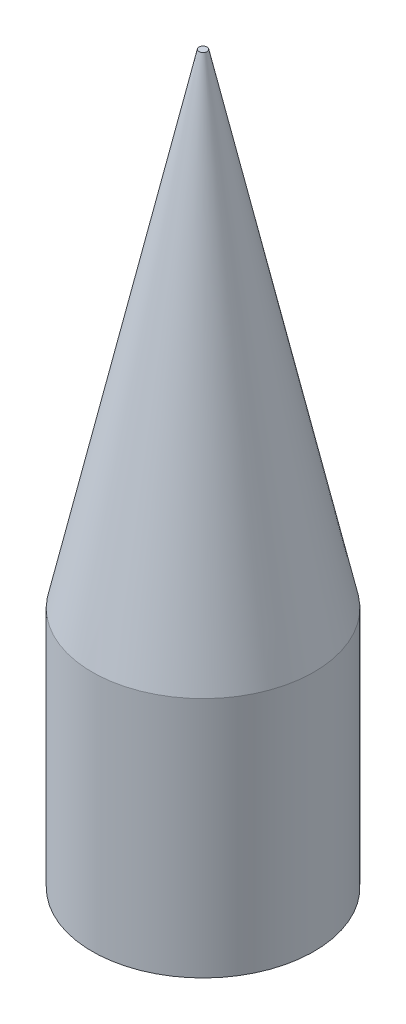
ISO-10303-21;
HEADER;
FILE_DESCRIPTION(('STEP AP214'),'2;1');
FILE_NAME('part.step','',(''),(''),'','','');
FILE_SCHEMA(('AUTOMOTIVE_DESIGN { 1 0 10303 214 1 1 1 1 }'));
ENDSEC;
DATA;
#1=APPLICATION_CONTEXT('core data for automotive mechanical design processes');
#2=APPLICATION_PROTOCOL_DEFINITION('international standard','automotive_design',2000,#1);
#3=PRODUCT_CONTEXT('',#1,'mechanical');
#4=PRODUCT('Part','Part','',(#3));
#5=PRODUCT_RELATED_PRODUCT_CATEGORY('part','',(#4));
#6=PRODUCT_DEFINITION_FORMATION('','',#4);
#7=PRODUCT_DEFINITION_CONTEXT('part definition',#1,'design');
#8=PRODUCT_DEFINITION('design','',#6,#7);
#9=PRODUCT_DEFINITION_SHAPE('','',#8);
#10=(LENGTH_UNIT() NAMED_UNIT(*) SI_UNIT(.MILLI.,.METRE.));
#11=(NAMED_UNIT(*) PLANE_ANGLE_UNIT() SI_UNIT($,.RADIAN.));
#12=(NAMED_UNIT(*) SI_UNIT($,.STERADIAN.) SOLID_ANGLE_UNIT());
#13=UNCERTAINTY_MEASURE_WITH_UNIT(LENGTH_MEASURE(1.E-05),#10,'distance_accuracy_value','');
#14=(GEOMETRIC_REPRESENTATION_CONTEXT(3) GLOBAL_UNCERTAINTY_ASSIGNED_CONTEXT((#13)) GLOBAL_UNIT_ASSIGNED_CONTEXT((#10,
#11,#12)) REPRESENTATION_CONTEXT('',''));
#15=CARTESIAN_POINT('',(0.,0.,0.));
#16=DIRECTION('',(0.,0.,1.));
#17=DIRECTION('',(1.,0.,0.));
#18=AXIS2_PLACEMENT_3D('',#15,#16,#17);
#19=CARTESIAN_POINT('',(0.,120.,0.));
#20=DIRECTION('',(0.,1.,0.));
#21=DIRECTION('',(0.,0.,1.));
#22=AXIS2_PLACEMENT_3D('',#19,#20,#21);
#23=PLANE('',#22);
#24=CARTESIAN_POINT('',(0.,120.,0.));
#25=DIRECTION('',(0.,-1.,0.));
#26=DIRECTION('',(0.,0.,-1.));
#27=AXIS2_PLACEMENT_3D('',#24,#25,#26);
#28=CIRCLE('',#27,1.);
#29=CARTESIAN_POINT('',(0.,120.,-0.999999999999997));
#30=VERTEX_POINT('',#29);
#31=EDGE_CURVE('E10',#30,#30,#28,.T.);
#32=ORIENTED_EDGE('',*,*,#31,.F.);
#33=EDGE_LOOP('',(#32));
#34=FACE_BOUND('',#33,.T.);
#35=ADVANCED_FACE('F31',(#34),#23,.T.);
#36=CARTESIAN_POINT('',(0.,0.,0.));
#37=DIRECTION('',(0.,-1.,0.));
#38=DIRECTION('',(0.,0.,-1.));
#39=AXIS2_PLACEMENT_3D('',#36,#37,#38);
#40=CONICAL_SURFACE('',#39,27.5,0.217345027847799);
#41=CARTESIAN_POINT('',(0.,0.,0.));
#42=DIRECTION('',(0.,-1.,0.));
#43=DIRECTION('',(0.,0.,-1.));
#44=AXIS2_PLACEMENT_3D('',#41,#42,#43);
#45=CIRCLE('',#44,27.5);
#46=CARTESIAN_POINT('',(0.,0.,-27.5));
#47=VERTEX_POINT('',#46);
#48=EDGE_CURVE('E37',#47,#47,#45,.T.);
#49=CARTESIAN_POINT('',(0.,120.,-0.999999999999997));
#50=CARTESIAN_POINT('',(0.,118.75,-1.27604166666667));
#51=CARTESIAN_POINT('',(0.,117.5,-1.55208333333333));
#52=CARTESIAN_POINT('',(0.,115.,-2.10416666666667));
#53=CARTESIAN_POINT('',(0.,113.75,-2.38020833333333));
#54=CARTESIAN_POINT('',(0.,111.25,-2.93229166666666));
#55=CARTESIAN_POINT('',(0.,110.,-3.20833333333333));
#56=CARTESIAN_POINT('',(0.,107.5,-3.76041666666667));
#57=CARTESIAN_POINT('',(0.,106.25,-4.03645833333333));
#58=CARTESIAN_POINT('',(0.,103.75,-4.58854166666667));
#59=CARTESIAN_POINT('',(0.,102.5,-4.86458333333333));
#60=CARTESIAN_POINT('',(0.,100.,-5.41666666666667));
#61=CARTESIAN_POINT('',(0.,98.75,-5.69270833333333));
#62=CARTESIAN_POINT('',(0.,96.25,-6.24479166666667));
#63=CARTESIAN_POINT('',(0.,95.,-6.52083333333333));
#64=CARTESIAN_POINT('',(0.,92.5,-7.07291666666666));
#65=CARTESIAN_POINT('',(0.,91.25,-7.34895833333333));
#66=CARTESIAN_POINT('',(0.,88.75,-7.90104166666667));
#67=CARTESIAN_POINT('',(0.,87.5,-8.17708333333333));
#68=CARTESIAN_POINT('',(0.,85.,-8.72916666666667));
#69=CARTESIAN_POINT('',(0.,83.75,-9.00520833333333));
#70=CARTESIAN_POINT('',(0.,81.25,-9.55729166666667));
#71=CARTESIAN_POINT('',(0.,80.,-9.83333333333333));
#72=CARTESIAN_POINT('',(0.,77.5,-10.3854166666667));
#73=CARTESIAN_POINT('',(0.,76.25,-10.6614583333333));
#74=CARTESIAN_POINT('',(0.,73.75,-11.2135416666667));
#75=CARTESIAN_POINT('',(0.,72.5,-11.4895833333333));
#76=CARTESIAN_POINT('',(0.,70.,-12.0416666666667));
#77=CARTESIAN_POINT('',(0.,68.75,-12.3177083333333));
#78=CARTESIAN_POINT('',(0.,66.25,-12.8697916666667));
#79=CARTESIAN_POINT('',(0.,65.,-13.1458333333333));
#80=CARTESIAN_POINT('',(0.,62.5,-13.6979166666667));
#81=CARTESIAN_POINT('',(0.,61.25,-13.9739583333333));
#82=CARTESIAN_POINT('',(0.,58.75,-14.5260416666667));
#83=CARTESIAN_POINT('',(0.,57.5,-14.8020833333333));
#84=CARTESIAN_POINT('',(0.,55.,-15.3541666666667));
#85=CARTESIAN_POINT('',(0.,53.75,-15.6302083333333));
#86=CARTESIAN_POINT('',(0.,51.25,-16.1822916666667));
#87=CARTESIAN_POINT('',(0.,50.,-16.4583333333333));
#88=CARTESIAN_POINT('',(0.,47.5,-17.0104166666667));
#89=CARTESIAN_POINT('',(0.,46.25,-17.2864583333333));
#90=CARTESIAN_POINT('',(0.,43.75,-17.8385416666667));
#91=CARTESIAN_POINT('',(0.,42.5,-18.1145833333333));
#92=CARTESIAN_POINT('',(0.,40.,-18.6666666666667));
#93=CARTESIAN_POINT('',(0.,38.75,-18.9427083333333));
#94=CARTESIAN_POINT('',(0.,36.25,-19.4947916666667));
#95=CARTESIAN_POINT('',(0.,35.,-19.7708333333333));
#96=CARTESIAN_POINT('',(0.,32.5,-20.3229166666667));
#97=CARTESIAN_POINT('',(0.,31.25,-20.5989583333333));
#98=CARTESIAN_POINT('',(0.,28.75,-21.1510416666667));
#99=CARTESIAN_POINT('',(0.,27.5,-21.4270833333333));
#100=CARTESIAN_POINT('',(0.,25.,-21.9791666666667));
#101=CARTESIAN_POINT('',(0.,23.75,-22.2552083333333));
#102=CARTESIAN_POINT('',(0.,21.25,-22.8072916666667));
#103=CARTESIAN_POINT('',(0.,20.,-23.0833333333333));
#104=CARTESIAN_POINT('',(0.,17.5,-23.6354166666667));
#105=CARTESIAN_POINT('',(0.,16.25,-23.9114583333333));
#106=CARTESIAN_POINT('',(0.,13.75,-24.4635416666667));
#107=CARTESIAN_POINT('',(0.,12.5,-24.7395833333333));
#108=CARTESIAN_POINT('',(0.,10.,-25.2916666666667));
#109=CARTESIAN_POINT('',(0.,8.75,-25.5677083333333));
#110=CARTESIAN_POINT('',(0.,6.25000000000001,-26.1197916666667));
#111=CARTESIAN_POINT('',(0.,5.,-26.3958333333333));
#112=CARTESIAN_POINT('',(0.,2.5,-26.9479166666667));
#113=CARTESIAN_POINT('',(0.,1.25,-27.2239583333333));
#114=CARTESIAN_POINT('',(0.,0.,-27.5));
#115=B_SPLINE_CURVE_WITH_KNOTS('',3,(#49,#50,#51,#52,#53,#54,#55,#56,#57,#58,#59,#60,#61,#62,
#63,#64,#65,#66,#67,#68,#69,#70,#71,#72,#73,#74,#75,#76,#77,#78,#79,#80,#81,#82,#83,#84,#85,#86,
#87,#88,#89,#90,#91,#92,#93,#94,#95,#96,#97,#98,#99,#100,#101,#102,#103,#104,#105,#106,#107,
#108,#109,#110,#111,#112,#113,#114),.UNSPECIFIED.,.F.,.F.,(4,2,2,2,2,2,2,2,2,2,2,2,2,2,2,2,2,2,
2,2,2,2,2,2,2,2,2,2,2,2,2,2,4),(0.,3.84035037667464,7.68070075334927,11.5210511300239,
15.3614015066985,19.2017518833732,23.0421022600478,26.8824526367224,30.7228030133971,
34.5631533900717,38.4035037667463,42.243854143421,46.0842045200956,49.9245548967702,
53.7649052734449,57.6052556501195,61.4456060267941,65.2859564034688,69.1263067801434,
72.966657156818,76.8070075334927,80.6473579101673,84.487708286842,88.3280586635166,
92.1684090401912,96.0087594168659,99.8491097935405,103.689460170215,107.52981054689,
111.370160923564,115.210511300239,119.050861676914,122.891212053588),.UNSPECIFIED.);
#116=EDGE_CURVE('BSEAM70',#30,#47,#115,.T.);
#117=ORIENTED_EDGE('',*,*,#31,.T.);
#118=ORIENTED_EDGE('',*,*,#48,.F.);
#119=ORIENTED_EDGE('',*,*,#116,.T.);
#120=ORIENTED_EDGE('',*,*,#116,.F.);
#121=EDGE_LOOP('',(#117,#119,#118,#120));
#122=FACE_BOUND('',#121,.T.);
#123=ADVANCED_FACE('F70',(#122),#40,.T.);
#124=CARTESIAN_POINT('',(0.,-60.,0.));
#125=DIRECTION('',(0.,1.,0.));
#126=DIRECTION('',(0.,0.,1.));
#127=AXIS2_PLACEMENT_3D('',#124,#125,#126);
#128=CYLINDRICAL_SURFACE('',#127,27.5);
#129=CARTESIAN_POINT('',(0.,-60.,0.));
#130=DIRECTION('',(0.,-1.,0.));
#131=DIRECTION('',(0.,0.,-1.));
#132=AXIS2_PLACEMENT_3D('',#129,#130,#131);
#133=CIRCLE('',#132,27.5);
#134=CARTESIAN_POINT('',(0.,-60.,-27.5));
#135=VERTEX_POINT('',#134);
#136=EDGE_CURVE('E41',#135,#135,#133,.T.);
#137=ORIENTED_EDGE('',*,*,#136,.F.);
#138=EDGE_LOOP('',(#137));
#139=FACE_BOUND('',#138,.T.);
#140=ORIENTED_EDGE('',*,*,#48,.T.);
#141=EDGE_LOOP('',(#140));
#142=FACE_BOUND('',#141,.T.);
#143=ADVANCED_FACE('F65',(#139,#142),#128,.T.);
#144=CARTESIAN_POINT('',(0.,-60.,0.));
#145=DIRECTION('',(0.,-1.,0.));
#146=DIRECTION('',(0.,0.,-1.));
#147=AXIS2_PLACEMENT_3D('',#144,#145,#146);
#148=PLANE('',#147);
#149=CARTESIAN_POINT('',(0.,-60.,0.));
#150=DIRECTION('',(0.,-1.,0.));
#151=DIRECTION('',(0.,0.,-1.));
#152=AXIS2_PLACEMENT_3D('',#149,#150,#151);
#153=CIRCLE('',#152,25.);
#154=CARTESIAN_POINT('',(0.,-60.,-25.));
#155=VERTEX_POINT('',#154);
#156=EDGE_CURVE('E48',#155,#155,#153,.T.);
#157=ORIENTED_EDGE('',*,*,#156,.F.);
#158=EDGE_LOOP('',(#157));
#159=FACE_BOUND('',#158,.T.);
#160=ORIENTED_EDGE('',*,*,#136,.T.);
#161=EDGE_LOOP('',(#160));
#162=FACE_BOUND('',#161,.T.);
#163=ADVANCED_FACE('F59',(#159,#162),#148,.T.);
#164=CARTESIAN_POINT('',(0.,-9.99999999999999,0.));
#165=DIRECTION('',(0.,-1.,0.));
#166=DIRECTION('',(0.,0.,-1.));
#167=AXIS2_PLACEMENT_3D('',#164,#165,#166);
#168=CYLINDRICAL_SURFACE('',#167,25.);
#169=CARTESIAN_POINT('',(0.,-9.99999999999999,0.));
#170=DIRECTION('',(0.,-1.,0.));
#171=DIRECTION('',(0.,0.,-1.));
#172=AXIS2_PLACEMENT_3D('',#169,#170,#171);
#173=CIRCLE('',#172,25.);
#174=CARTESIAN_POINT('',(0.,-9.99999999999999,-25.));
#175=VERTEX_POINT('',#174);
#176=EDGE_CURVE('E45',#175,#175,#173,.T.);
#177=ORIENTED_EDGE('',*,*,#176,.F.);
#178=EDGE_LOOP('',(#177));
#179=FACE_BOUND('',#178,.T.);
#180=ORIENTED_EDGE('',*,*,#156,.T.);
#181=EDGE_LOOP('',(#180));
#182=FACE_BOUND('',#181,.T.);
#183=ADVANCED_FACE('F56',(#179,#182),#168,.F.);
#184=CARTESIAN_POINT('',(0.,-9.99999999999999,0.));
#185=DIRECTION('',(0.,-1.,0.));
#186=DIRECTION('',(0.,0.,-1.));
#187=AXIS2_PLACEMENT_3D('',#184,#185,#186);
#188=PLANE('',#187);
#189=ORIENTED_EDGE('',*,*,#176,.T.);
#190=EDGE_LOOP('',(#189));
#191=FACE_BOUND('',#190,.T.);
#192=ADVANCED_FACE('F54',(#191),#188,.T.);
#193=CLOSED_SHELL('',(#35,#123,#143,#163,#183,#192));
#194=MANIFOLD_SOLID_BREP('B2',#193);
#195=ADVANCED_BREP_SHAPE_REPRESENTATION('',(#18,#194),#14);
#196=SHAPE_DEFINITION_REPRESENTATION(#9,#195);
ENDSEC;
END-ISO-10303-21;
